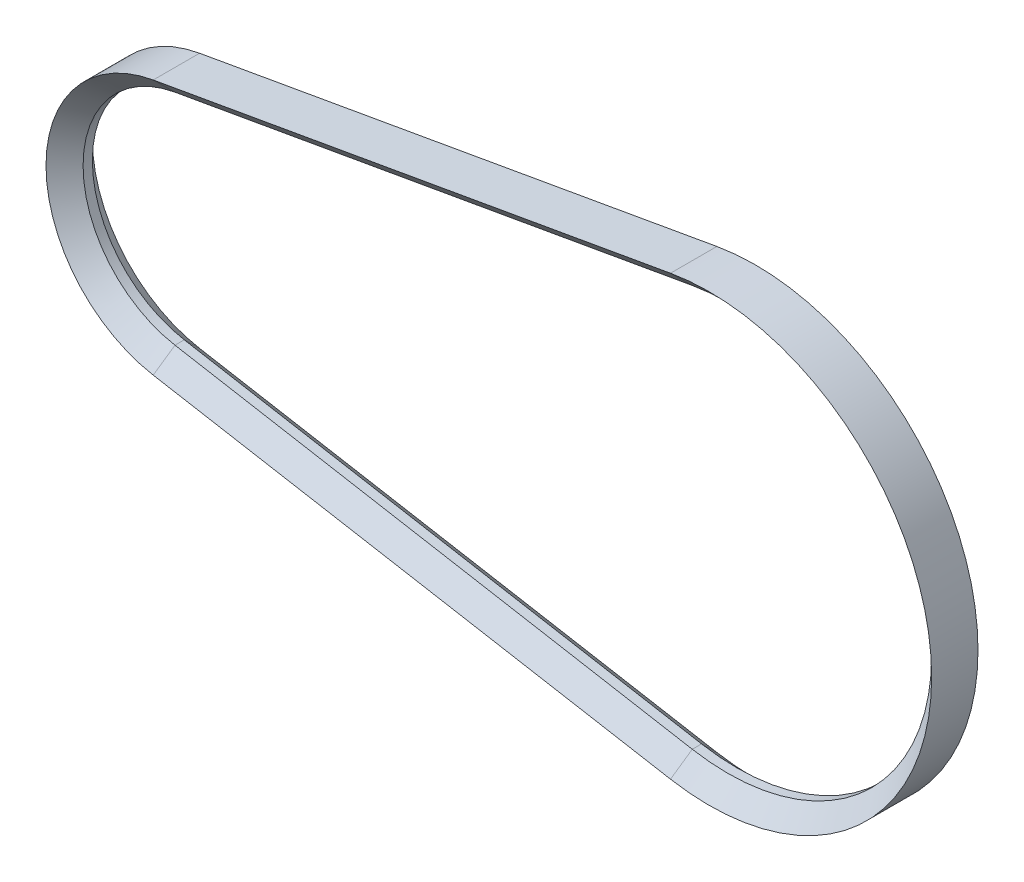
ISO-10303-21;
HEADER;
FILE_DESCRIPTION(('STEP AP214'),'2;1');
FILE_NAME('part.step','',(''),(''),'','','');
FILE_SCHEMA(('AUTOMOTIVE_DESIGN { 1 0 10303 214 1 1 1 1 }'));
ENDSEC;
DATA;
#1=APPLICATION_CONTEXT('core data for automotive mechanical design processes');
#2=APPLICATION_PROTOCOL_DEFINITION('international standard','automotive_design',2000,#1);
#3=PRODUCT_CONTEXT('',#1,'mechanical');
#4=PRODUCT('Part','Part','',(#3));
#5=PRODUCT_RELATED_PRODUCT_CATEGORY('part','',(#4));
#6=PRODUCT_DEFINITION_FORMATION('','',#4);
#7=PRODUCT_DEFINITION_CONTEXT('part definition',#1,'design');
#8=PRODUCT_DEFINITION('design','',#6,#7);
#9=PRODUCT_DEFINITION_SHAPE('','',#8);
#10=(LENGTH_UNIT() NAMED_UNIT(*) SI_UNIT(.MILLI.,.METRE.));
#11=(NAMED_UNIT(*) PLANE_ANGLE_UNIT() SI_UNIT($,.RADIAN.));
#12=(NAMED_UNIT(*) SI_UNIT($,.STERADIAN.) SOLID_ANGLE_UNIT());
#13=UNCERTAINTY_MEASURE_WITH_UNIT(LENGTH_MEASURE(1.E-05),#10,'distance_accuracy_value','');
#14=(GEOMETRIC_REPRESENTATION_CONTEXT(3) GLOBAL_UNCERTAINTY_ASSIGNED_CONTEXT((#13)) GLOBAL_UNIT_ASSIGNED_CONTEXT((#10,
#11,#12)) REPRESENTATION_CONTEXT('',''));
#15=CARTESIAN_POINT('',(0.,0.,0.));
#16=DIRECTION('',(0.,0.,1.));
#17=DIRECTION('',(1.,0.,0.));
#18=AXIS2_PLACEMENT_3D('',#15,#16,#17);
#19=CARTESIAN_POINT('',(26.6844942648591,11.8173882828946,1.25));
#20=DIRECTION('',(-0.122889603960122,0.696346282562433,-0.707106781186551));
#21=DIRECTION('',(0.,0.712507339544742,0.701664657151031));
#22=AXIS2_PLACEMENT_3D('',#19,#20,#21);
#23=PLANE('',#22);
#24=DIRECTION('',(0.122889603960134,-0.696346282562438,-0.707106781186544));
#25=VECTOR('',#24,1.);
#26=CARTESIAN_POINT('',(26.6844942648591,11.8173882828946,1.25));
#27=LINE('',#26,#25);
#28=CARTESIAN_POINT('',(26.6844942648591,11.8173882828946,1.25));
#29=VERTEX_POINT('',#28);
#30=CARTESIAN_POINT('',(26.8582864094541,10.8326059259867,0.25000000000001));
#31=VERTEX_POINT('',#30);
#32=EDGE_CURVE('E163',#29,#31,#27,.T.);
#33=ORIENTED_EDGE('',*,*,#32,.F.);
#34=DIRECTION('',(-0.984782356907885,-0.173792144595064,0.));
#35=VECTOR('',#34,1.);
#36=CARTESIAN_POINT('',(26.6844942648591,11.8173882828946,1.25));
#37=LINE('',#36,#35);
#38=CARTESIAN_POINT('',(-1.21654501216562,6.89347649835516,1.25));
#39=VERTEX_POINT('',#38);
#40=EDGE_CURVE('E41',#29,#39,#37,.T.);
#41=ORIENTED_EDGE('',*,*,#40,.T.);
#42=DIRECTION('',(0.122889603960134,-0.696346282562438,-0.707106781186544));
#43=VECTOR('',#42,1.);
#44=CARTESIAN_POINT('',(-1.21654501216562,6.89347649835516,1.25));
#45=LINE('',#44,#43);
#46=CARTESIAN_POINT('',(-1.04275286757054,5.90869414144727,0.25000000000001));
#47=VERTEX_POINT('',#46);
#48=EDGE_CURVE('E184',#39,#47,#45,.T.);
#49=ORIENTED_EDGE('',*,*,#48,.T.);
#50=DIRECTION('',(-0.984782356907885,-0.173792144595064,0.));
#51=VECTOR('',#50,1.);
#52=CARTESIAN_POINT('',(26.8582864094541,10.8326059259867,0.25000000000001));
#53=LINE('',#52,#51);
#54=EDGE_CURVE('E11',#31,#47,#53,.T.);
#55=ORIENTED_EDGE('',*,*,#54,.F.);
#56=EDGE_LOOP('',(#33,#41,#49,#55));
#57=FACE_BOUND('',#56,.T.);
#58=ADVANCED_FACE('F33',(#57),#23,.F.);
#59=CARTESIAN_POINT('',(26.6844942648591,11.8173882828946,1.25));
#60=DIRECTION('',(0.173792144595064,-0.984782356907885,0.));
#61=DIRECTION('',(0.984782356907885,0.173792144595064,0.));
#62=AXIS2_PLACEMENT_3D('',#59,#60,#61);
#63=PLANE('',#62);
#64=DIRECTION('',(0.,0.,1.));
#65=VECTOR('',#64,1.);
#66=CARTESIAN_POINT('',(26.6844942648591,11.8173882828946,1.25));
#67=LINE('',#66,#65);
#68=CARTESIAN_POINT('',(26.6844942648591,11.8173882828946,-1.25));
#69=VERTEX_POINT('',#68);
#70=EDGE_CURVE('E160',#69,#29,#67,.T.);
#71=ORIENTED_EDGE('',*,*,#70,.F.);
#72=DIRECTION('',(-0.984782356907885,-0.173792144595064,0.));
#73=VECTOR('',#72,1.);
#74=CARTESIAN_POINT('',(26.6844942648591,11.8173882828946,-1.25));
#75=LINE('',#74,#73);
#76=CARTESIAN_POINT('',(-1.21654501216562,6.89347649835516,-1.25));
#77=VERTEX_POINT('',#76);
#78=EDGE_CURVE('E190',#69,#77,#75,.T.);
#79=ORIENTED_EDGE('',*,*,#78,.T.);
#80=DIRECTION('',(0.,0.,1.));
#81=VECTOR('',#80,1.);
#82=CARTESIAN_POINT('',(-1.21654501216562,6.89347649835516,1.25));
#83=LINE('',#82,#81);
#84=EDGE_CURVE('E181',#77,#39,#83,.T.);
#85=ORIENTED_EDGE('',*,*,#84,.T.);
#86=ORIENTED_EDGE('',*,*,#40,.F.);
#87=EDGE_LOOP('',(#71,#79,#85,#86));
#88=FACE_BOUND('',#87,.T.);
#89=ADVANCED_FACE('F209',(#88),#63,.F.);
#90=CARTESIAN_POINT('',(26.6844942648591,11.8173882828946,-1.25));
#91=DIRECTION('',(-0.122889603960122,0.696346282562433,0.70710678118655));
#92=DIRECTION('',(0.,-0.712507339544742,0.701664657151031));
#93=AXIS2_PLACEMENT_3D('',#90,#91,#92);
#94=PLANE('',#93);
#95=DIRECTION('',(-0.122889603960134,0.696346282562437,-0.707106781186545));
#96=VECTOR('',#95,1.);
#97=CARTESIAN_POINT('',(26.6844942648591,11.8173882828946,-1.25));
#98=LINE('',#97,#96);
#99=CARTESIAN_POINT('',(26.8582864094541,10.8326059259867,-0.250000000000008));
#100=VERTEX_POINT('',#99);
#101=EDGE_CURVE('E157',#100,#69,#98,.T.);
#102=ORIENTED_EDGE('',*,*,#101,.F.);
#103=DIRECTION('',(-0.984782356907885,-0.173792144595064,0.));
#104=VECTOR('',#103,1.);
#105=CARTESIAN_POINT('',(26.8582864094541,10.8326059259867,-0.250000000000008));
#106=LINE('',#105,#104);
#107=CARTESIAN_POINT('',(-1.04275286757054,5.90869414144727,-0.250000000000008));
#108=VERTEX_POINT('',#107);
#109=EDGE_CURVE('E187',#100,#108,#106,.T.);
#110=ORIENTED_EDGE('',*,*,#109,.T.);
#111=DIRECTION('',(-0.122889603960134,0.696346282562437,-0.707106781186545));
#112=VECTOR('',#111,1.);
#113=CARTESIAN_POINT('',(-1.21654501216562,6.89347649835516,-1.25));
#114=LINE('',#113,#112);
#115=EDGE_CURVE('E129',#108,#77,#114,.T.);
#116=ORIENTED_EDGE('',*,*,#115,.T.);
#117=ORIENTED_EDGE('',*,*,#78,.F.);
#118=EDGE_LOOP('',(#102,#110,#116,#117));
#119=FACE_BOUND('',#118,.T.);
#120=ADVANCED_FACE('F207',(#119),#94,.F.);
#121=CARTESIAN_POINT('',(26.8582864094541,10.8326059259867,-0.250000000000008));
#122=DIRECTION('',(-0.173792144595064,0.984782356907885,0.));
#123=DIRECTION('',(-0.984782356907885,-0.173792144595064,0.));
#124=AXIS2_PLACEMENT_3D('',#121,#122,#123);
#125=PLANE('',#124);
#126=DIRECTION('',(0.,0.,-1.));
#127=VECTOR('',#126,1.);
#128=CARTESIAN_POINT('',(26.8582864094541,10.8326059259867,-0.250000000000008));
#129=LINE('',#128,#127);
#130=EDGE_CURVE('E154',#31,#100,#129,.T.);
#131=ORIENTED_EDGE('',*,*,#130,.F.);
#132=ORIENTED_EDGE('',*,*,#54,.T.);
#133=DIRECTION('',(0.,0.,-1.));
#134=VECTOR('',#133,1.);
#135=CARTESIAN_POINT('',(-1.04275286757054,5.90869414144727,-0.250000000000008));
#136=LINE('',#135,#134);
#137=EDGE_CURVE('E178',#47,#108,#136,.T.);
#138=ORIENTED_EDGE('',*,*,#137,.T.);
#139=ORIENTED_EDGE('',*,*,#109,.F.);
#140=EDGE_LOOP('',(#131,#132,#138,#139));
#141=FACE_BOUND('',#140,.T.);
#142=ADVANCED_FACE('F227',(#141),#125,.F.);
#143=CARTESIAN_POINT('',(28.77,0.,1.25));
#144=DIRECTION('',(0.,0.,1.));
#145=DIRECTION('',(1.,0.,0.));
#146=AXIS2_PLACEMENT_3D('',#143,#144,#145);
#147=CONICAL_SURFACE('',#146,12.,0.785398163397454);
#148=DIRECTION('',(0.122889603960123,0.69634628256244,-0.707106781186544));
#149=VECTOR('',#148,1.);
#150=CARTESIAN_POINT('',(26.6844942648592,-11.8173882828946,1.25));
#151=LINE('',#150,#149);
#152=CARTESIAN_POINT('',(26.6844942648592,-11.8173882828946,1.25));
#153=VERTEX_POINT('',#152);
#154=CARTESIAN_POINT('',(26.8582864094543,-10.8326059259867,0.25000000000001));
#155=VERTEX_POINT('',#154);
#156=EDGE_CURVE('E114',#153,#155,#151,.T.);
#157=ORIENTED_EDGE('',*,*,#156,.F.);
#158=CARTESIAN_POINT('',(28.77,0.,1.25));
#159=DIRECTION('',(0.,0.,1.));
#160=DIRECTION('',(1.,0.,0.));
#161=AXIS2_PLACEMENT_3D('',#158,#159,#160);
#162=CIRCLE('',#161,12.);
#163=EDGE_CURVE('E172',#153,#29,#162,.T.);
#164=ORIENTED_EDGE('',*,*,#163,.T.);
#165=ORIENTED_EDGE('',*,*,#32,.T.);
#166=CARTESIAN_POINT('',(28.77,0.,0.25000000000001));
#167=DIRECTION('',(0.,0.,1.));
#168=DIRECTION('',(1.,0.,0.));
#169=AXIS2_PLACEMENT_3D('',#166,#167,#168);
#170=CIRCLE('',#169,11.);
#171=EDGE_CURVE('E175',#155,#31,#170,.T.);
#172=ORIENTED_EDGE('',*,*,#171,.F.);
#173=EDGE_LOOP('',(#157,#164,#165,#172));
#174=FACE_BOUND('',#173,.T.);
#175=ADVANCED_FACE('F230',(#174),#147,.F.);
#176=CARTESIAN_POINT('',(28.77,0.,0.));
#177=DIRECTION('',(0.,0.,1.));
#178=DIRECTION('',(1.,0.,0.));
#179=AXIS2_PLACEMENT_3D('',#176,#177,#178);
#180=CYLINDRICAL_SURFACE('',#179,12.);
#181=DIRECTION('',(0.,0.,1.));
#182=VECTOR('',#181,1.);
#183=CARTESIAN_POINT('',(26.6844942648592,-11.8173882828946,1.25));
#184=LINE('',#183,#182);
#185=CARTESIAN_POINT('',(26.6844942648592,-11.8173882828946,-1.25));
#186=VERTEX_POINT('',#185);
#187=EDGE_CURVE('E143',#186,#153,#184,.T.);
#188=ORIENTED_EDGE('',*,*,#187,.F.);
#189=CARTESIAN_POINT('',(28.77,0.,-1.25));
#190=DIRECTION('',(0.,0.,1.));
#191=DIRECTION('',(1.,0.,0.));
#192=AXIS2_PLACEMENT_3D('',#189,#190,#191);
#193=CIRCLE('',#192,12.);
#194=EDGE_CURVE('E169',#186,#69,#193,.T.);
#195=ORIENTED_EDGE('',*,*,#194,.T.);
#196=ORIENTED_EDGE('',*,*,#70,.T.);
#197=ORIENTED_EDGE('',*,*,#163,.F.);
#198=EDGE_LOOP('',(#188,#195,#196,#197));
#199=FACE_BOUND('',#198,.T.);
#200=ADVANCED_FACE('F216',(#199),#180,.T.);
#201=CARTESIAN_POINT('',(28.77,0.,-0.250000000000008));
#202=DIRECTION('',(0.,0.,-1.));
#203=DIRECTION('',(-1.,0.,0.));
#204=AXIS2_PLACEMENT_3D('',#201,#202,#203);
#205=CONICAL_SURFACE('',#204,11.,0.785398163397453);
#206=DIRECTION('',(-0.122889603960123,-0.696346282562439,-0.707106781186545));
#207=VECTOR('',#206,1.);
#208=CARTESIAN_POINT('',(26.6844942648592,-11.8173882828946,-1.25));
#209=LINE('',#208,#207);
#210=CARTESIAN_POINT('',(26.8582864094543,-10.8326059259867,-0.250000000000008));
#211=VERTEX_POINT('',#210);
#212=EDGE_CURVE('E141',#211,#186,#209,.T.);
#213=ORIENTED_EDGE('',*,*,#212,.F.);
#214=CARTESIAN_POINT('',(28.77,0.,-0.250000000000008));
#215=DIRECTION('',(0.,0.,1.));
#216=DIRECTION('',(1.,0.,0.));
#217=AXIS2_PLACEMENT_3D('',#214,#215,#216);
#218=CIRCLE('',#217,11.);
#219=EDGE_CURVE('E166',#211,#100,#218,.T.);
#220=ORIENTED_EDGE('',*,*,#219,.T.);
#221=ORIENTED_EDGE('',*,*,#101,.T.);
#222=ORIENTED_EDGE('',*,*,#194,.F.);
#223=EDGE_LOOP('',(#213,#220,#221,#222));
#224=FACE_BOUND('',#223,.T.);
#225=ADVANCED_FACE('F214',(#224),#205,.F.);
#226=CARTESIAN_POINT('',(28.77,0.,0.));
#227=DIRECTION('',(0.,0.,1.));
#228=DIRECTION('',(1.,0.,0.));
#229=AXIS2_PLACEMENT_3D('',#226,#227,#228);
#230=CYLINDRICAL_SURFACE('',#229,11.);
#231=DIRECTION('',(0.,0.,-1.));
#232=VECTOR('',#231,1.);
#233=CARTESIAN_POINT('',(26.8582864094543,-10.8326059259867,-0.250000000000008));
#234=LINE('',#233,#232);
#235=EDGE_CURVE('E110',#155,#211,#234,.T.);
#236=ORIENTED_EDGE('',*,*,#235,.F.);
#237=ORIENTED_EDGE('',*,*,#171,.T.);
#238=ORIENTED_EDGE('',*,*,#130,.T.);
#239=ORIENTED_EDGE('',*,*,#219,.F.);
#240=EDGE_LOOP('',(#236,#237,#238,#239));
#241=FACE_BOUND('',#240,.T.);
#242=ADVANCED_FACE('F231',(#241),#230,.F.);
#243=CARTESIAN_POINT('',(-1.21654501216544,-6.89347649835519,1.25));
#244=DIRECTION('',(-0.122889603960122,-0.696346282562433,-0.707106781186551));
#245=DIRECTION('',(0.,0.712507339544742,-0.701664657151031));
#246=AXIS2_PLACEMENT_3D('',#243,#244,#245);
#247=PLANE('',#246);
#248=DIRECTION('',(0.122889603960123,0.69634628256244,-0.707106781186544));
#249=VECTOR('',#248,1.);
#250=CARTESIAN_POINT('',(-1.21654501216544,-6.89347649835519,1.25));
#251=LINE('',#250,#249);
#252=CARTESIAN_POINT('',(-1.21654501216544,-6.89347649835519,1.25));
#253=VERTEX_POINT('',#252);
#254=CARTESIAN_POINT('',(-1.04275286757038,-5.90869414144731,0.25000000000001));
#255=VERTEX_POINT('',#254);
#256=EDGE_CURVE('E138',#253,#255,#251,.T.);
#257=ORIENTED_EDGE('',*,*,#256,.F.);
#258=DIRECTION('',(0.984782356907885,-0.173792144595064,0.));
#259=VECTOR('',#258,1.);
#260=CARTESIAN_POINT('',(-1.21654501216544,-6.89347649835519,1.25));
#261=LINE('',#260,#259);
#262=EDGE_CURVE('E149',#253,#153,#261,.T.);
#263=ORIENTED_EDGE('',*,*,#262,.T.);
#264=ORIENTED_EDGE('',*,*,#156,.T.);
#265=DIRECTION('',(0.984782356907885,-0.173792144595064,0.));
#266=VECTOR('',#265,1.);
#267=CARTESIAN_POINT('',(-1.04275286757038,-5.90869414144731,0.25000000000001));
#268=LINE('',#267,#266);
#269=EDGE_CURVE('E152',#255,#155,#268,.T.);
#270=ORIENTED_EDGE('',*,*,#269,.F.);
#271=EDGE_LOOP('',(#257,#263,#264,#270));
#272=FACE_BOUND('',#271,.T.);
#273=ADVANCED_FACE('F222',(#272),#247,.F.);
#274=CARTESIAN_POINT('',(-1.21654501216544,-6.89347649835519,1.25));
#275=DIRECTION('',(0.173792144595064,0.984782356907885,0.));
#276=DIRECTION('',(-0.984782356907885,0.173792144595064,0.));
#277=AXIS2_PLACEMENT_3D('',#274,#275,#276);
#278=PLANE('',#277);
#279=DIRECTION('',(0.,0.,1.));
#280=VECTOR('',#279,1.);
#281=CARTESIAN_POINT('',(-1.21654501216544,-6.89347649835519,1.25));
#282=LINE('',#281,#280);
#283=CARTESIAN_POINT('',(-1.21654501216544,-6.89347649835519,-1.25));
#284=VERTEX_POINT('',#283);
#285=EDGE_CURVE('E123',#284,#253,#282,.T.);
#286=ORIENTED_EDGE('',*,*,#285,.F.);
#287=DIRECTION('',(0.984782356907885,-0.173792144595064,0.));
#288=VECTOR('',#287,1.);
#289=CARTESIAN_POINT('',(-1.21654501216544,-6.89347649835519,-1.25));
#290=LINE('',#289,#288);
#291=EDGE_CURVE('E113',#284,#186,#290,.T.);
#292=ORIENTED_EDGE('',*,*,#291,.T.);
#293=ORIENTED_EDGE('',*,*,#187,.T.);
#294=ORIENTED_EDGE('',*,*,#262,.F.);
#295=EDGE_LOOP('',(#286,#292,#293,#294));
#296=FACE_BOUND('',#295,.T.);
#297=ADVANCED_FACE('F219',(#296),#278,.F.);
#298=CARTESIAN_POINT('',(-1.21654501216544,-6.89347649835519,-1.25));
#299=DIRECTION('',(-0.122889603960122,-0.696346282562433,0.70710678118655));
#300=DIRECTION('',(0.,-0.712507339544742,-0.701664657151031));
#301=AXIS2_PLACEMENT_3D('',#298,#299,#300);
#302=PLANE('',#301);
#303=DIRECTION('',(-0.122889603960123,-0.696346282562439,-0.707106781186545));
#304=VECTOR('',#303,1.);
#305=CARTESIAN_POINT('',(-1.21654501216544,-6.89347649835519,-1.25));
#306=LINE('',#305,#304);
#307=CARTESIAN_POINT('',(-1.04275286757038,-5.90869414144731,-0.250000000000008));
#308=VERTEX_POINT('',#307);
#309=EDGE_CURVE('E117',#308,#284,#306,.T.);
#310=ORIENTED_EDGE('',*,*,#309,.F.);
#311=DIRECTION('',(0.984782356907885,-0.173792144595064,0.));
#312=VECTOR('',#311,1.);
#313=CARTESIAN_POINT('',(-1.04275286757038,-5.90869414144731,-0.250000000000008));
#314=LINE('',#313,#312);
#315=EDGE_CURVE('E103',#308,#211,#314,.T.);
#316=ORIENTED_EDGE('',*,*,#315,.T.);
#317=ORIENTED_EDGE('',*,*,#212,.T.);
#318=ORIENTED_EDGE('',*,*,#291,.F.);
#319=EDGE_LOOP('',(#310,#316,#317,#318));
#320=FACE_BOUND('',#319,.T.);
#321=ADVANCED_FACE('F119',(#320),#302,.F.);
#322=CARTESIAN_POINT('',(-1.04275286757038,-5.90869414144731,-0.250000000000008));
#323=DIRECTION('',(-0.173792144595064,-0.984782356907885,0.));
#324=DIRECTION('',(0.984782356907885,-0.173792144595064,0.));
#325=AXIS2_PLACEMENT_3D('',#322,#323,#324);
#326=PLANE('',#325);
#327=DIRECTION('',(0.,0.,-1.));
#328=VECTOR('',#327,1.);
#329=CARTESIAN_POINT('',(-1.04275286757038,-5.90869414144731,-0.250000000000008));
#330=LINE('',#329,#328);
#331=EDGE_CURVE('E108',#255,#308,#330,.T.);
#332=ORIENTED_EDGE('',*,*,#331,.F.);
#333=ORIENTED_EDGE('',*,*,#269,.T.);
#334=ORIENTED_EDGE('',*,*,#235,.T.);
#335=ORIENTED_EDGE('',*,*,#315,.F.);
#336=EDGE_LOOP('',(#332,#333,#334,#335));
#337=FACE_BOUND('',#336,.T.);
#338=ADVANCED_FACE('F105',(#337),#326,.F.);
#339=CARTESIAN_POINT('',(0.,0.,0.));
#340=DIRECTION('',(0.,0.,-1.));
#341=DIRECTION('',(-1.,0.,0.));
#342=AXIS2_PLACEMENT_3D('',#339,#340,#341);
#343=CYLINDRICAL_SURFACE('',#342,6.);
#344=CARTESIAN_POINT('',(0.,0.,-0.250000000000008));
#345=DIRECTION('',(0.,0.,-1.));
#346=DIRECTION('',(-1.,0.,0.));
#347=AXIS2_PLACEMENT_3D('',#344,#345,#346);
#348=CIRCLE('',#347,6.);
#349=EDGE_CURVE('E126',#308,#108,#348,.T.);
#350=ORIENTED_EDGE('',*,*,#349,.T.);
#351=ORIENTED_EDGE('',*,*,#137,.F.);
#352=CARTESIAN_POINT('',(0.,0.,0.25000000000001));
#353=DIRECTION('',(0.,0.,-1.));
#354=DIRECTION('',(-1.,0.,0.));
#355=AXIS2_PLACEMENT_3D('',#352,#353,#354);
#356=CIRCLE('',#355,6.);
#357=EDGE_CURVE('E49',#255,#47,#356,.T.);
#358=ORIENTED_EDGE('',*,*,#357,.F.);
#359=ORIENTED_EDGE('',*,*,#331,.T.);
#360=EDGE_LOOP('',(#350,#351,#358,#359));
#361=FACE_BOUND('',#360,.T.);
#362=ADVANCED_FACE('F134',(#361),#343,.F.);
#363=CARTESIAN_POINT('',(0.,0.,-0.250000000000008));
#364=DIRECTION('',(0.,0.,-1.));
#365=DIRECTION('',(-1.,0.,0.));
#366=AXIS2_PLACEMENT_3D('',#363,#364,#365);
#367=CONICAL_SURFACE('',#366,6.,0.785398163397452);
#368=CARTESIAN_POINT('',(0.,0.,-1.25));
#369=DIRECTION('',(0.,0.,-1.));
#370=DIRECTION('',(-1.,0.,0.));
#371=AXIS2_PLACEMENT_3D('',#368,#369,#370);
#372=CIRCLE('',#371,7.);
#373=EDGE_CURVE('E132',#284,#77,#372,.T.);
#374=ORIENTED_EDGE('',*,*,#373,.T.);
#375=ORIENTED_EDGE('',*,*,#115,.F.);
#376=ORIENTED_EDGE('',*,*,#349,.F.);
#377=ORIENTED_EDGE('',*,*,#309,.T.);
#378=EDGE_LOOP('',(#374,#375,#376,#377));
#379=FACE_BOUND('',#378,.T.);
#380=ADVANCED_FACE('F127',(#379),#367,.F.);
#381=CARTESIAN_POINT('',(0.,0.,0.));
#382=DIRECTION('',(0.,0.,-1.));
#383=DIRECTION('',(-1.,0.,0.));
#384=AXIS2_PLACEMENT_3D('',#381,#382,#383);
#385=CYLINDRICAL_SURFACE('',#384,7.);
#386=CARTESIAN_POINT('',(0.,0.,1.25));
#387=DIRECTION('',(0.,0.,-1.));
#388=DIRECTION('',(-1.,0.,0.));
#389=AXIS2_PLACEMENT_3D('',#386,#387,#388);
#390=CIRCLE('',#389,7.);
#391=EDGE_CURVE('E57',#253,#39,#390,.T.);
#392=ORIENTED_EDGE('',*,*,#391,.T.);
#393=ORIENTED_EDGE('',*,*,#84,.F.);
#394=ORIENTED_EDGE('',*,*,#373,.F.);
#395=ORIENTED_EDGE('',*,*,#285,.T.);
#396=EDGE_LOOP('',(#392,#393,#394,#395));
#397=FACE_BOUND('',#396,.T.);
#398=ADVANCED_FACE('F203',(#397),#385,.T.);
#399=CARTESIAN_POINT('',(0.,0.,1.25));
#400=DIRECTION('',(0.,0.,1.));
#401=DIRECTION('',(1.,0.,0.));
#402=AXIS2_PLACEMENT_3D('',#399,#400,#401);
#403=CONICAL_SURFACE('',#402,7.,0.785398163397453);
#404=ORIENTED_EDGE('',*,*,#256,.T.);
#405=ORIENTED_EDGE('',*,*,#357,.T.);
#406=ORIENTED_EDGE('',*,*,#48,.F.);
#407=ORIENTED_EDGE('',*,*,#391,.F.);
#408=EDGE_LOOP('',(#404,#405,#406,#407));
#409=FACE_BOUND('',#408,.T.);
#410=ADVANCED_FACE('F223',(#409),#403,.F.);
#411=CLOSED_SHELL('',(#58,#89,#120,#142,#175,#200,#225,#242,#273,#297,#321,#338,#362,#380,#398,#410));
#412=MANIFOLD_SOLID_BREP('B2',#411);
#413=ADVANCED_BREP_SHAPE_REPRESENTATION('',(#18,#412),#14);
#414=SHAPE_DEFINITION_REPRESENTATION(#9,#413);
ENDSEC;
END-ISO-10303-21;
